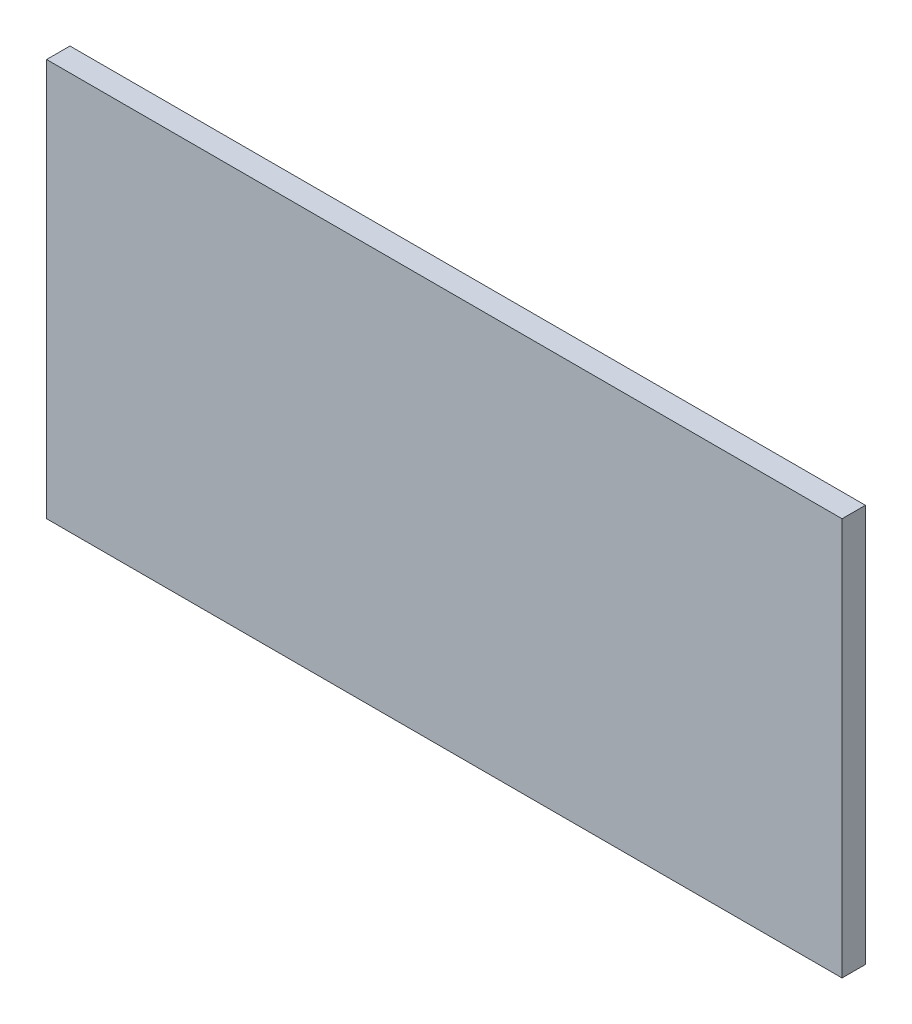
ISO-10303-21;
HEADER;
FILE_DESCRIPTION(('STEP AP214'),'2;1');
FILE_NAME('part.step','',(''),(''),'','','');
FILE_SCHEMA(('AUTOMOTIVE_DESIGN { 1 0 10303 214 1 1 1 1 }'));
ENDSEC;
DATA;
#1=APPLICATION_CONTEXT('core data for automotive mechanical design processes');
#2=APPLICATION_PROTOCOL_DEFINITION('international standard','automotive_design',2000,#1);
#3=PRODUCT_CONTEXT('',#1,'mechanical');
#4=PRODUCT('Part','Part','',(#3));
#5=PRODUCT_RELATED_PRODUCT_CATEGORY('part','',(#4));
#6=PRODUCT_DEFINITION_FORMATION('','',#4);
#7=PRODUCT_DEFINITION_CONTEXT('part definition',#1,'design');
#8=PRODUCT_DEFINITION('design','',#6,#7);
#9=PRODUCT_DEFINITION_SHAPE('','',#8);
#10=(LENGTH_UNIT() NAMED_UNIT(*) SI_UNIT(.MILLI.,.METRE.));
#11=(NAMED_UNIT(*) PLANE_ANGLE_UNIT() SI_UNIT($,.RADIAN.));
#12=(NAMED_UNIT(*) SI_UNIT($,.STERADIAN.) SOLID_ANGLE_UNIT());
#13=UNCERTAINTY_MEASURE_WITH_UNIT(LENGTH_MEASURE(1.E-05),#10,'distance_accuracy_value','');
#14=(GEOMETRIC_REPRESENTATION_CONTEXT(3) GLOBAL_UNCERTAINTY_ASSIGNED_CONTEXT((#13)) GLOBAL_UNIT_ASSIGNED_CONTEXT((#10,
#11,#12)) REPRESENTATION_CONTEXT('',''));
#15=CARTESIAN_POINT('',(0.,0.,0.));
#16=DIRECTION('',(0.,0.,1.));
#17=DIRECTION('',(1.,0.,0.));
#18=AXIS2_PLACEMENT_3D('',#15,#16,#17);
#19=CARTESIAN_POINT('',(0.,0.,0.));
#20=DIRECTION('',(0.,0.,1.));
#21=DIRECTION('',(1.,0.,0.));
#22=AXIS2_PLACEMENT_3D('',#19,#20,#21);
#23=PLANE('',#22);
#24=DIRECTION('',(-1.,0.,0.));
#25=VECTOR('',#24,1.);
#26=CARTESIAN_POINT('',(1.702,0.851,0.));
#27=LINE('',#26,#25);
#28=CARTESIAN_POINT('',(1.702,0.851,0.));
#29=VERTEX_POINT('',#28);
#30=CARTESIAN_POINT('',(-1.702,0.851,0.));
#31=VERTEX_POINT('',#30);
#32=EDGE_CURVE('E79',#29,#31,#27,.T.);
#33=ORIENTED_EDGE('',*,*,#32,.F.);
#34=DIRECTION('',(0.,1.,0.));
#35=VECTOR('',#34,1.);
#36=CARTESIAN_POINT('',(1.702,-0.851,0.));
#37=LINE('',#36,#35);
#38=CARTESIAN_POINT('',(1.702,-0.851,0.));
#39=VERTEX_POINT('',#38);
#40=EDGE_CURVE('E55',#39,#29,#37,.T.);
#41=ORIENTED_EDGE('',*,*,#40,.F.);
#42=DIRECTION('',(1.,0.,0.));
#43=VECTOR('',#42,1.);
#44=CARTESIAN_POINT('',(-1.702,-0.851,0.));
#45=LINE('',#44,#43);
#46=CARTESIAN_POINT('',(-1.702,-0.851,0.));
#47=VERTEX_POINT('',#46);
#48=EDGE_CURVE('E57',#47,#39,#45,.T.);
#49=ORIENTED_EDGE('',*,*,#48,.F.);
#50=DIRECTION('',(0.,1.,0.));
#51=VECTOR('',#50,1.);
#52=CARTESIAN_POINT('',(-1.702,0.851,0.));
#53=LINE('',#52,#51);
#54=EDGE_CURVE('E20',#31,#47,#53,.F.);
#55=ORIENTED_EDGE('',*,*,#54,.F.);
#56=EDGE_LOOP('',(#33,#41,#49,#55));
#57=FACE_BOUND('',#56,.T.);
#58=ADVANCED_FACE('F17',(#57),#23,.F.);
#59=CARTESIAN_POINT('',(-1.702,0.851,0.));
#60=DIRECTION('',(-1.,0.,0.));
#61=DIRECTION('',(0.,0.,1.));
#62=AXIS2_PLACEMENT_3D('',#59,#60,#61);
#63=PLANE('',#62);
#64=DIRECTION('',(0.,1.,0.));
#65=VECTOR('',#64,1.);
#66=CARTESIAN_POINT('',(-1.702,0.,0.1));
#67=LINE('',#66,#65);
#68=CARTESIAN_POINT('',(-1.702,0.851,0.1));
#69=VERTEX_POINT('',#68);
#70=CARTESIAN_POINT('',(-1.702,-0.851,0.1));
#71=VERTEX_POINT('',#70);
#72=EDGE_CURVE('E83',#69,#71,#67,.F.);
#73=ORIENTED_EDGE('',*,*,#72,.F.);
#74=DIRECTION('',(0.,0.,1.));
#75=VECTOR('',#74,1.);
#76=CARTESIAN_POINT('',(-1.702,0.851,0.));
#77=LINE('',#76,#75);
#78=EDGE_CURVE('E68',#31,#69,#77,.T.);
#79=ORIENTED_EDGE('',*,*,#78,.F.);
#80=ORIENTED_EDGE('',*,*,#54,.T.);
#81=DIRECTION('',(0.,0.,-1.));
#82=VECTOR('',#81,1.);
#83=CARTESIAN_POINT('',(-1.702,-0.851,0.));
#84=LINE('',#83,#82);
#85=EDGE_CURVE('E63',#71,#47,#84,.T.);
#86=ORIENTED_EDGE('',*,*,#85,.F.);
#87=EDGE_LOOP('',(#73,#79,#80,#86));
#88=FACE_BOUND('',#87,.T.);
#89=ADVANCED_FACE('F65',(#88),#63,.T.);
#90=CARTESIAN_POINT('',(-1.702,-0.851,0.));
#91=DIRECTION('',(0.,-1.,0.));
#92=DIRECTION('',(0.,0.,-1.));
#93=AXIS2_PLACEMENT_3D('',#90,#91,#92);
#94=PLANE('',#93);
#95=DIRECTION('',(1.,0.,0.));
#96=VECTOR('',#95,1.);
#97=CARTESIAN_POINT('',(0.,-0.851,0.1));
#98=LINE('',#97,#96);
#99=CARTESIAN_POINT('',(1.702,-0.851,0.1));
#100=VERTEX_POINT('',#99);
#101=EDGE_CURVE('E72',#71,#100,#98,.T.);
#102=ORIENTED_EDGE('',*,*,#101,.F.);
#103=ORIENTED_EDGE('',*,*,#85,.T.);
#104=ORIENTED_EDGE('',*,*,#48,.T.);
#105=DIRECTION('',(0.,0.,-1.));
#106=VECTOR('',#105,1.);
#107=CARTESIAN_POINT('',(1.702,-0.851,0.));
#108=LINE('',#107,#106);
#109=EDGE_CURVE('E75',#100,#39,#108,.T.);
#110=ORIENTED_EDGE('',*,*,#109,.F.);
#111=EDGE_LOOP('',(#102,#103,#104,#110));
#112=FACE_BOUND('',#111,.T.);
#113=ADVANCED_FACE('F70',(#112),#94,.T.);
#114=CARTESIAN_POINT('',(1.702,-0.851,0.));
#115=DIRECTION('',(1.,0.,0.));
#116=DIRECTION('',(0.,0.,-1.));
#117=AXIS2_PLACEMENT_3D('',#114,#115,#116);
#118=PLANE('',#117);
#119=DIRECTION('',(0.,1.,0.));
#120=VECTOR('',#119,1.);
#121=CARTESIAN_POINT('',(1.702,0.,0.1));
#122=LINE('',#121,#120);
#123=CARTESIAN_POINT('',(1.702,0.851,0.1));
#124=VERTEX_POINT('',#123);
#125=EDGE_CURVE('E26',#100,#124,#122,.T.);
#126=ORIENTED_EDGE('',*,*,#125,.F.);
#127=ORIENTED_EDGE('',*,*,#109,.T.);
#128=ORIENTED_EDGE('',*,*,#40,.T.);
#129=DIRECTION('',(0.,0.,1.));
#130=VECTOR('',#129,1.);
#131=CARTESIAN_POINT('',(1.702,0.851,0.));
#132=LINE('',#131,#130);
#133=EDGE_CURVE('E35',#124,#29,#132,.F.);
#134=ORIENTED_EDGE('',*,*,#133,.F.);
#135=EDGE_LOOP('',(#126,#127,#128,#134));
#136=FACE_BOUND('',#135,.T.);
#137=ADVANCED_FACE('F89',(#136),#118,.T.);
#138=CARTESIAN_POINT('',(1.702,0.851,0.));
#139=DIRECTION('',(0.,1.,0.));
#140=DIRECTION('',(-1.,0.,0.));
#141=AXIS2_PLACEMENT_3D('',#138,#139,#140);
#142=PLANE('',#141);
#143=DIRECTION('',(1.,0.,0.));
#144=VECTOR('',#143,1.);
#145=CARTESIAN_POINT('',(0.,0.851,0.1));
#146=LINE('',#145,#144);
#147=EDGE_CURVE('E11',#124,#69,#146,.F.);
#148=ORIENTED_EDGE('',*,*,#147,.F.);
#149=ORIENTED_EDGE('',*,*,#133,.T.);
#150=ORIENTED_EDGE('',*,*,#32,.T.);
#151=ORIENTED_EDGE('',*,*,#78,.T.);
#152=EDGE_LOOP('',(#148,#149,#150,#151));
#153=FACE_BOUND('',#152,.T.);
#154=ADVANCED_FACE('F91',(#153),#142,.T.);
#155=CARTESIAN_POINT('',(0.,0.,0.1));
#156=DIRECTION('',(0.,0.,1.));
#157=DIRECTION('',(1.,0.,0.));
#158=AXIS2_PLACEMENT_3D('',#155,#156,#157);
#159=PLANE('',#158);
#160=ORIENTED_EDGE('',*,*,#125,.T.);
#161=ORIENTED_EDGE('',*,*,#147,.T.);
#162=ORIENTED_EDGE('',*,*,#72,.T.);
#163=ORIENTED_EDGE('',*,*,#101,.T.);
#164=EDGE_LOOP('',(#160,#161,#162,#163));
#165=FACE_BOUND('',#164,.T.);
#166=ADVANCED_FACE('F88',(#165),#159,.T.);
#167=CLOSED_SHELL('',(#58,#89,#113,#137,#154,#166));
#168=MANIFOLD_SOLID_BREP('B1',#167);
#169=ADVANCED_BREP_SHAPE_REPRESENTATION('',(#18,#168),#14);
#170=SHAPE_DEFINITION_REPRESENTATION(#9,#169);
ENDSEC;
END-ISO-10303-21;
